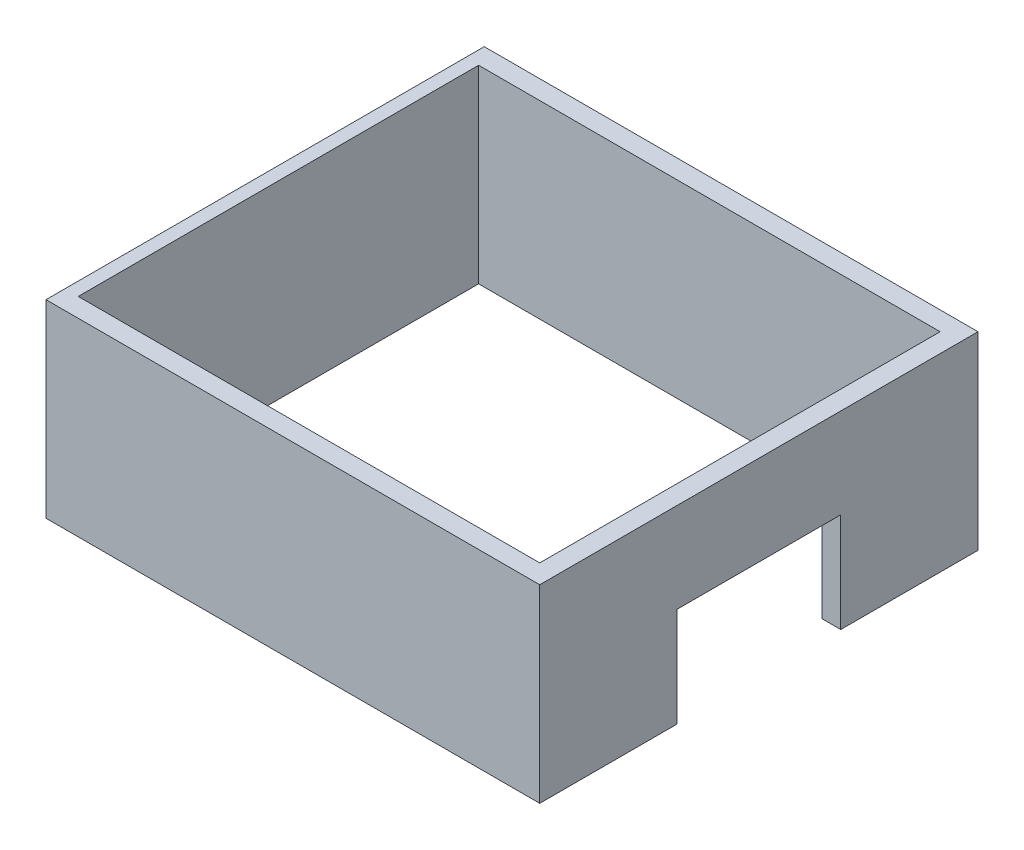
ISO-10303-21;
HEADER;
FILE_DESCRIPTION(('STEP AP214'),'2;1');
FILE_NAME('part.step','',(''),(''),'','','');
FILE_SCHEMA(('AUTOMOTIVE_DESIGN { 1 0 10303 214 1 1 1 1 }'));
ENDSEC;
DATA;
#1=APPLICATION_CONTEXT('core data for automotive mechanical design processes');
#2=APPLICATION_PROTOCOL_DEFINITION('international standard','automotive_design',2000,#1);
#3=PRODUCT_CONTEXT('',#1,'mechanical');
#4=PRODUCT('Part','Part','',(#3));
#5=PRODUCT_RELATED_PRODUCT_CATEGORY('part','',(#4));
#6=PRODUCT_DEFINITION_FORMATION('','',#4);
#7=PRODUCT_DEFINITION_CONTEXT('part definition',#1,'design');
#8=PRODUCT_DEFINITION('design','',#6,#7);
#9=PRODUCT_DEFINITION_SHAPE('','',#8);
#10=(LENGTH_UNIT() NAMED_UNIT(*) SI_UNIT(.MILLI.,.METRE.));
#11=(NAMED_UNIT(*) PLANE_ANGLE_UNIT() SI_UNIT($,.RADIAN.));
#12=(NAMED_UNIT(*) SI_UNIT($,.STERADIAN.) SOLID_ANGLE_UNIT());
#13=UNCERTAINTY_MEASURE_WITH_UNIT(LENGTH_MEASURE(1.E-05),#10,'distance_accuracy_value','');
#14=(GEOMETRIC_REPRESENTATION_CONTEXT(3) GLOBAL_UNCERTAINTY_ASSIGNED_CONTEXT((#13)) GLOBAL_UNIT_ASSIGNED_CONTEXT((#10,
#11,#12)) REPRESENTATION_CONTEXT('',''));
#15=CARTESIAN_POINT('',(0.,0.,0.));
#16=DIRECTION('',(0.,0.,1.));
#17=DIRECTION('',(1.,0.,0.));
#18=AXIS2_PLACEMENT_3D('',#15,#16,#17);
#19=CARTESIAN_POINT('',(23.2591645516478,20.,0.));
#20=DIRECTION('',(-1.,0.,0.));
#21=DIRECTION('',(0.,0.,1.));
#22=AXIS2_PLACEMENT_3D('',#19,#20,#21);
#23=PLANE('',#22);
#24=DIRECTION('',(0.,0.,-1.));
#25=VECTOR('',#24,1.);
#26=CARTESIAN_POINT('',(23.2591645516478,0.,0.));
#27=LINE('',#26,#25);
#28=CARTESIAN_POINT('',(23.2591645516478,0.,23.15));
#29=VERTEX_POINT('',#28);
#30=CARTESIAN_POINT('',(23.2591645516478,0.,8.65));
#31=VERTEX_POINT('',#30);
#32=EDGE_CURVE('E164',#29,#31,#27,.T.);
#33=ORIENTED_EDGE('',*,*,#32,.T.);
#34=DIRECTION('',(0.,-1.,0.));
#35=VECTOR('',#34,1.);
#36=CARTESIAN_POINT('',(23.2591645516478,0.,8.65));
#37=LINE('',#36,#35);
#38=CARTESIAN_POINT('',(23.2591645516478,10.5,8.65));
#39=VERTEX_POINT('',#38);
#40=EDGE_CURVE('E201',#39,#31,#37,.T.);
#41=ORIENTED_EDGE('',*,*,#40,.F.);
#42=DIRECTION('',(0.,0.,1.));
#43=VECTOR('',#42,1.);
#44=CARTESIAN_POINT('',(23.2591645516478,10.5,8.65));
#45=LINE('',#44,#43);
#46=CARTESIAN_POINT('',(23.2591645516478,10.5,-8.64999999999999));
#47=VERTEX_POINT('',#46);
#48=EDGE_CURVE('E210',#47,#39,#45,.T.);
#49=ORIENTED_EDGE('',*,*,#48,.F.);
#50=DIRECTION('',(0.,1.,0.));
#51=VECTOR('',#50,1.);
#52=CARTESIAN_POINT('',(23.2591645516478,10.5,-8.64999999999999));
#53=LINE('',#52,#51);
#54=CARTESIAN_POINT('',(23.2591645516478,0.,-8.65));
#55=VERTEX_POINT('',#54);
#56=EDGE_CURVE('E207',#55,#47,#53,.T.);
#57=ORIENTED_EDGE('',*,*,#56,.F.);
#58=CARTESIAN_POINT('',(23.2591645516478,0.,-23.15));
#59=VERTEX_POINT('',#58);
#60=EDGE_CURVE('E163',#55,#59,#27,.T.);
#61=ORIENTED_EDGE('',*,*,#60,.T.);
#62=DIRECTION('',(0.,-1.,0.));
#63=VECTOR('',#62,1.);
#64=CARTESIAN_POINT('',(23.2591645516478,20.,-23.15));
#65=LINE('',#64,#63);
#66=CARTESIAN_POINT('',(23.2591645516478,20.,-23.15));
#67=VERTEX_POINT('',#66);
#68=EDGE_CURVE('E140',#67,#59,#65,.T.);
#69=ORIENTED_EDGE('',*,*,#68,.F.);
#70=DIRECTION('',(0.,0.,-1.));
#71=VECTOR('',#70,1.);
#72=CARTESIAN_POINT('',(23.2591645516478,20.,0.));
#73=LINE('',#72,#71);
#74=CARTESIAN_POINT('',(23.2591645516478,20.,23.15));
#75=VERTEX_POINT('',#74);
#76=EDGE_CURVE('E128',#75,#67,#73,.T.);
#77=ORIENTED_EDGE('',*,*,#76,.F.);
#78=DIRECTION('',(0.,-1.,0.));
#79=VECTOR('',#78,1.);
#80=CARTESIAN_POINT('',(23.2591645516478,20.,23.15));
#81=LINE('',#80,#79);
#82=EDGE_CURVE('E172',#75,#29,#81,.T.);
#83=ORIENTED_EDGE('',*,*,#82,.T.);
#84=EDGE_LOOP('',(#33,#41,#49,#57,#61,#69,#77,#83));
#85=FACE_BOUND('',#84,.T.);
#86=ADVANCED_FACE('F40',(#85),#23,.F.);
#87=CARTESIAN_POINT('',(0.,20.,-23.15));
#88=DIRECTION('',(0.,0.,1.));
#89=DIRECTION('',(1.,0.,0.));
#90=AXIS2_PLACEMENT_3D('',#87,#88,#89);
#91=PLANE('',#90);
#92=DIRECTION('',(-1.,0.,0.));
#93=VECTOR('',#92,1.);
#94=CARTESIAN_POINT('',(0.,0.,-23.15));
#95=LINE('',#94,#93);
#96=CARTESIAN_POINT('',(-28.9031266724193,0.,-23.15));
#97=VERTEX_POINT('',#96);
#98=EDGE_CURVE('E137',#59,#97,#95,.T.);
#99=ORIENTED_EDGE('',*,*,#98,.T.);
#100=DIRECTION('',(0.,-1.,0.));
#101=VECTOR('',#100,1.);
#102=CARTESIAN_POINT('',(-28.9031266724193,20.,-23.15));
#103=LINE('',#102,#101);
#104=CARTESIAN_POINT('',(-28.9031266724193,20.,-23.15));
#105=VERTEX_POINT('',#104);
#106=EDGE_CURVE('E134',#105,#97,#103,.T.);
#107=ORIENTED_EDGE('',*,*,#106,.F.);
#108=DIRECTION('',(-1.,0.,0.));
#109=VECTOR('',#108,1.);
#110=CARTESIAN_POINT('',(0.,20.,-23.15));
#111=LINE('',#110,#109);
#112=EDGE_CURVE('E121',#67,#105,#111,.T.);
#113=ORIENTED_EDGE('',*,*,#112,.F.);
#114=ORIENTED_EDGE('',*,*,#68,.T.);
#115=EDGE_LOOP('',(#99,#107,#113,#114));
#116=FACE_BOUND('',#115,.T.);
#117=ADVANCED_FACE('F135',(#116),#91,.F.);
#118=CARTESIAN_POINT('',(-28.9031266724193,20.,0.));
#119=DIRECTION('',(1.,0.,0.));
#120=DIRECTION('',(0.,0.,-1.));
#121=AXIS2_PLACEMENT_3D('',#118,#119,#120);
#122=PLANE('',#121);
#123=DIRECTION('',(0.,0.,1.));
#124=VECTOR('',#123,1.);
#125=CARTESIAN_POINT('',(-28.9031266724193,0.,0.));
#126=LINE('',#125,#124);
#127=CARTESIAN_POINT('',(-28.9031266724193,0.,23.15));
#128=VERTEX_POINT('',#127);
#129=EDGE_CURVE('E168',#97,#128,#126,.T.);
#130=ORIENTED_EDGE('',*,*,#129,.T.);
#131=DIRECTION('',(0.,-1.,0.));
#132=VECTOR('',#131,1.);
#133=CARTESIAN_POINT('',(-28.9031266724193,20.,23.15));
#134=LINE('',#133,#132);
#135=CARTESIAN_POINT('',(-28.9031266724193,20.,23.15));
#136=VERTEX_POINT('',#135);
#137=EDGE_CURVE('E141',#136,#128,#134,.T.);
#138=ORIENTED_EDGE('',*,*,#137,.F.);
#139=DIRECTION('',(0.,0.,1.));
#140=VECTOR('',#139,1.);
#141=CARTESIAN_POINT('',(-28.9031266724193,20.,0.));
#142=LINE('',#141,#140);
#143=EDGE_CURVE('E125',#105,#136,#142,.T.);
#144=ORIENTED_EDGE('',*,*,#143,.F.);
#145=ORIENTED_EDGE('',*,*,#106,.T.);
#146=EDGE_LOOP('',(#130,#138,#144,#145));
#147=FACE_BOUND('',#146,.T.);
#148=ADVANCED_FACE('F143',(#147),#122,.F.);
#149=CARTESIAN_POINT('',(-27.4990039314352,20.,0.));
#150=DIRECTION('',(1.,0.,0.));
#151=DIRECTION('',(0.,0.,-1.));
#152=AXIS2_PLACEMENT_3D('',#149,#150,#151);
#153=PLANE('',#152);
#154=DIRECTION('',(0.,0.,1.));
#155=VECTOR('',#154,1.);
#156=CARTESIAN_POINT('',(-27.4990039314352,0.,0.));
#157=LINE('',#156,#155);
#158=CARTESIAN_POINT('',(-27.4990039314352,0.,-21.15));
#159=VERTEX_POINT('',#158);
#160=CARTESIAN_POINT('',(-27.4990039314352,0.,21.15));
#161=VERTEX_POINT('',#160);
#162=EDGE_CURVE('E149',#159,#161,#157,.T.);
#163=ORIENTED_EDGE('',*,*,#162,.F.);
#164=DIRECTION('',(0.,-1.,0.));
#165=VECTOR('',#164,1.);
#166=CARTESIAN_POINT('',(-27.4990039314352,20.,-21.15));
#167=LINE('',#166,#165);
#168=CARTESIAN_POINT('',(-27.4990039314352,20.,-21.15));
#169=VERTEX_POINT('',#168);
#170=EDGE_CURVE('E105',#169,#159,#167,.T.);
#171=ORIENTED_EDGE('',*,*,#170,.F.);
#172=DIRECTION('',(0.,0.,1.));
#173=VECTOR('',#172,1.);
#174=CARTESIAN_POINT('',(-27.4990039314352,20.,0.));
#175=LINE('',#174,#173);
#176=CARTESIAN_POINT('',(-27.4990039314352,20.,21.15));
#177=VERTEX_POINT('',#176);
#178=EDGE_CURVE('E171',#169,#177,#175,.T.);
#179=ORIENTED_EDGE('',*,*,#178,.T.);
#180=DIRECTION('',(0.,-1.,0.));
#181=VECTOR('',#180,1.);
#182=CARTESIAN_POINT('',(-27.4990039314352,20.,21.15));
#183=LINE('',#182,#181);
#184=EDGE_CURVE('E145',#177,#161,#183,.T.);
#185=ORIENTED_EDGE('',*,*,#184,.T.);
#186=EDGE_LOOP('',(#163,#171,#179,#185));
#187=FACE_BOUND('',#186,.T.);
#188=ADVANCED_FACE('F42',(#187),#153,.T.);
#189=CARTESIAN_POINT('',(0.,20.,-21.15));
#190=DIRECTION('',(0.,0.,1.));
#191=DIRECTION('',(1.,0.,0.));
#192=AXIS2_PLACEMENT_3D('',#189,#190,#191);
#193=PLANE('',#192);
#194=DIRECTION('',(-1.,0.,0.));
#195=VECTOR('',#194,1.);
#196=CARTESIAN_POINT('',(0.,0.,-21.15));
#197=LINE('',#196,#195);
#198=CARTESIAN_POINT('',(21.2591645516478,0.,-21.15));
#199=VERTEX_POINT('',#198);
#200=EDGE_CURVE('E152',#199,#159,#197,.T.);
#201=ORIENTED_EDGE('',*,*,#200,.F.);
#202=DIRECTION('',(0.,-1.,0.));
#203=VECTOR('',#202,1.);
#204=CARTESIAN_POINT('',(21.2591645516478,20.,-21.15));
#205=LINE('',#204,#203);
#206=CARTESIAN_POINT('',(21.2591645516478,20.,-21.15));
#207=VERTEX_POINT('',#206);
#208=EDGE_CURVE('E180',#207,#199,#205,.T.);
#209=ORIENTED_EDGE('',*,*,#208,.F.);
#210=DIRECTION('',(-1.,0.,0.));
#211=VECTOR('',#210,1.);
#212=CARTESIAN_POINT('',(0.,20.,-21.15));
#213=LINE('',#212,#211);
#214=EDGE_CURVE('E225',#207,#169,#213,.T.);
#215=ORIENTED_EDGE('',*,*,#214,.T.);
#216=ORIENTED_EDGE('',*,*,#170,.T.);
#217=EDGE_LOOP('',(#201,#209,#215,#216));
#218=FACE_BOUND('',#217,.T.);
#219=ADVANCED_FACE('F246',(#218),#193,.T.);
#220=CARTESIAN_POINT('',(21.2591645516478,20.,0.));
#221=DIRECTION('',(-1.,0.,0.));
#222=DIRECTION('',(0.,0.,1.));
#223=AXIS2_PLACEMENT_3D('',#220,#221,#222);
#224=PLANE('',#223);
#225=DIRECTION('',(0.,1.,0.));
#226=VECTOR('',#225,1.);
#227=CARTESIAN_POINT('',(21.2591645516478,20.,8.65));
#228=LINE('',#227,#226);
#229=CARTESIAN_POINT('',(21.2591645516478,0.,8.65));
#230=VERTEX_POINT('',#229);
#231=CARTESIAN_POINT('',(21.2591645516478,10.5,8.65));
#232=VERTEX_POINT('',#231);
#233=EDGE_CURVE('E153',#230,#232,#228,.T.);
#234=ORIENTED_EDGE('',*,*,#233,.F.);
#235=DIRECTION('',(0.,0.,-1.));
#236=VECTOR('',#235,1.);
#237=CARTESIAN_POINT('',(21.2591645516478,0.,0.));
#238=LINE('',#237,#236);
#239=CARTESIAN_POINT('',(21.2591645516478,0.,21.15));
#240=VERTEX_POINT('',#239);
#241=EDGE_CURVE('E157',#240,#230,#238,.T.);
#242=ORIENTED_EDGE('',*,*,#241,.F.);
#243=DIRECTION('',(0.,-1.,0.));
#244=VECTOR('',#243,1.);
#245=CARTESIAN_POINT('',(21.2591645516478,20.,21.15));
#246=LINE('',#245,#244);
#247=CARTESIAN_POINT('',(21.2591645516478,20.,21.15));
#248=VERTEX_POINT('',#247);
#249=EDGE_CURVE('E178',#248,#240,#246,.T.);
#250=ORIENTED_EDGE('',*,*,#249,.F.);
#251=DIRECTION('',(0.,0.,-1.));
#252=VECTOR('',#251,1.);
#253=CARTESIAN_POINT('',(21.2591645516478,20.,0.));
#254=LINE('',#253,#252);
#255=EDGE_CURVE('E228',#248,#207,#254,.T.);
#256=ORIENTED_EDGE('',*,*,#255,.T.);
#257=ORIENTED_EDGE('',*,*,#208,.T.);
#258=CARTESIAN_POINT('',(21.2591645516478,0.,-8.65));
#259=VERTEX_POINT('',#258);
#260=EDGE_CURVE('E156',#259,#199,#238,.T.);
#261=ORIENTED_EDGE('',*,*,#260,.F.);
#262=DIRECTION('',(0.,-1.,0.));
#263=VECTOR('',#262,1.);
#264=CARTESIAN_POINT('',(21.2591645516478,20.,-8.64999999999999));
#265=LINE('',#264,#263);
#266=CARTESIAN_POINT('',(21.2591645516478,10.5,-8.64999999999999));
#267=VERTEX_POINT('',#266);
#268=EDGE_CURVE('E55',#267,#259,#265,.T.);
#269=ORIENTED_EDGE('',*,*,#268,.F.);
#270=DIRECTION('',(0.,0.,-1.));
#271=VECTOR('',#270,1.);
#272=CARTESIAN_POINT('',(21.2591645516478,10.5,0.));
#273=LINE('',#272,#271);
#274=EDGE_CURVE('E11',#232,#267,#273,.T.);
#275=ORIENTED_EDGE('',*,*,#274,.F.);
#276=EDGE_LOOP('',(#234,#242,#250,#256,#257,#261,#269,#275));
#277=FACE_BOUND('',#276,.T.);
#278=ADVANCED_FACE('F241',(#277),#224,.T.);
#279=CARTESIAN_POINT('',(0.,20.,21.15));
#280=DIRECTION('',(0.,0.,-1.));
#281=DIRECTION('',(-1.,0.,0.));
#282=AXIS2_PLACEMENT_3D('',#279,#280,#281);
#283=PLANE('',#282);
#284=DIRECTION('',(1.,0.,0.));
#285=VECTOR('',#284,1.);
#286=CARTESIAN_POINT('',(0.,0.,21.15));
#287=LINE('',#286,#285);
#288=EDGE_CURVE('E160',#161,#240,#287,.T.);
#289=ORIENTED_EDGE('',*,*,#288,.F.);
#290=ORIENTED_EDGE('',*,*,#184,.F.);
#291=DIRECTION('',(1.,0.,0.));
#292=VECTOR('',#291,1.);
#293=CARTESIAN_POINT('',(0.,20.,21.15));
#294=LINE('',#293,#292);
#295=EDGE_CURVE('E231',#177,#248,#294,.T.);
#296=ORIENTED_EDGE('',*,*,#295,.T.);
#297=ORIENTED_EDGE('',*,*,#249,.T.);
#298=EDGE_LOOP('',(#289,#290,#296,#297));
#299=FACE_BOUND('',#298,.T.);
#300=ADVANCED_FACE('F236',(#299),#283,.T.);
#301=CARTESIAN_POINT('',(0.,20.,23.15));
#302=DIRECTION('',(0.,0.,-1.));
#303=DIRECTION('',(-1.,0.,0.));
#304=AXIS2_PLACEMENT_3D('',#301,#302,#303);
#305=PLANE('',#304);
#306=DIRECTION('',(1.,0.,0.));
#307=VECTOR('',#306,1.);
#308=CARTESIAN_POINT('',(0.,0.,23.15));
#309=LINE('',#308,#307);
#310=EDGE_CURVE('E97',#128,#29,#309,.T.);
#311=ORIENTED_EDGE('',*,*,#310,.T.);
#312=ORIENTED_EDGE('',*,*,#82,.F.);
#313=DIRECTION('',(1.,0.,0.));
#314=VECTOR('',#313,1.);
#315=CARTESIAN_POINT('',(0.,20.,23.15));
#316=LINE('',#315,#314);
#317=EDGE_CURVE('E64',#136,#75,#316,.T.);
#318=ORIENTED_EDGE('',*,*,#317,.F.);
#319=ORIENTED_EDGE('',*,*,#137,.T.);
#320=EDGE_LOOP('',(#311,#312,#318,#319));
#321=FACE_BOUND('',#320,.T.);
#322=ADVANCED_FACE('F202',(#321),#305,.F.);
#323=CARTESIAN_POINT('',(0.,20.,0.));
#324=DIRECTION('',(0.,1.,0.));
#325=DIRECTION('',(0.,0.,1.));
#326=AXIS2_PLACEMENT_3D('',#323,#324,#325);
#327=PLANE('',#326);
#328=ORIENTED_EDGE('',*,*,#178,.F.);
#329=ORIENTED_EDGE('',*,*,#214,.F.);
#330=ORIENTED_EDGE('',*,*,#255,.F.);
#331=ORIENTED_EDGE('',*,*,#295,.F.);
#332=EDGE_LOOP('',(#328,#329,#330,#331));
#333=FACE_BOUND('',#332,.T.);
#334=ORIENTED_EDGE('',*,*,#76,.T.);
#335=ORIENTED_EDGE('',*,*,#112,.T.);
#336=ORIENTED_EDGE('',*,*,#143,.T.);
#337=ORIENTED_EDGE('',*,*,#317,.T.);
#338=EDGE_LOOP('',(#334,#335,#336,#337));
#339=FACE_BOUND('',#338,.T.);
#340=ADVANCED_FACE('F123',(#333,#339),#327,.T.);
#341=CARTESIAN_POINT('',(0.,0.,0.));
#342=DIRECTION('',(0.,1.,0.));
#343=DIRECTION('',(0.,0.,1.));
#344=AXIS2_PLACEMENT_3D('',#341,#342,#343);
#345=PLANE('',#344);
#346=ORIENTED_EDGE('',*,*,#241,.T.);
#347=DIRECTION('',(1.,0.,0.));
#348=VECTOR('',#347,1.);
#349=CARTESIAN_POINT('',(0.,0.,8.65));
#350=LINE('',#349,#348);
#351=EDGE_CURVE('E48',#230,#31,#350,.T.);
#352=ORIENTED_EDGE('',*,*,#351,.T.);
#353=ORIENTED_EDGE('',*,*,#32,.F.);
#354=ORIENTED_EDGE('',*,*,#310,.F.);
#355=ORIENTED_EDGE('',*,*,#129,.F.);
#356=ORIENTED_EDGE('',*,*,#98,.F.);
#357=ORIENTED_EDGE('',*,*,#60,.F.);
#358=DIRECTION('',(-1.,0.,0.));
#359=VECTOR('',#358,1.);
#360=CARTESIAN_POINT('',(0.,0.,-8.65));
#361=LINE('',#360,#359);
#362=EDGE_CURVE('E176',#55,#259,#361,.T.);
#363=ORIENTED_EDGE('',*,*,#362,.T.);
#364=ORIENTED_EDGE('',*,*,#260,.T.);
#365=ORIENTED_EDGE('',*,*,#200,.T.);
#366=ORIENTED_EDGE('',*,*,#162,.T.);
#367=ORIENTED_EDGE('',*,*,#288,.T.);
#368=EDGE_LOOP('',(#346,#352,#353,#354,#355,#356,#357,#363,#364,#365,#366,#367));
#369=FACE_BOUND('',#368,.T.);
#370=ADVANCED_FACE('F189',(#369),#345,.F.);
#371=CARTESIAN_POINT('',(3.25916455164784,0.,8.65));
#372=DIRECTION('',(0.,0.,1.));
#373=DIRECTION('',(1.,0.,0.));
#374=AXIS2_PLACEMENT_3D('',#371,#372,#373);
#375=PLANE('',#374);
#376=ORIENTED_EDGE('',*,*,#233,.T.);
#377=DIRECTION('',(1.,0.,0.));
#378=VECTOR('',#377,1.);
#379=CARTESIAN_POINT('',(3.25916455164784,10.5,8.65));
#380=LINE('',#379,#378);
#381=EDGE_CURVE('E217',#232,#39,#380,.T.);
#382=ORIENTED_EDGE('',*,*,#381,.T.);
#383=ORIENTED_EDGE('',*,*,#40,.T.);
#384=ORIENTED_EDGE('',*,*,#351,.F.);
#385=EDGE_LOOP('',(#376,#382,#383,#384));
#386=FACE_BOUND('',#385,.T.);
#387=ADVANCED_FACE('F289',(#386),#375,.F.);
#388=CARTESIAN_POINT('',(3.25916455164784,10.5,8.65));
#389=DIRECTION('',(0.,1.,0.));
#390=DIRECTION('',(0.,0.,1.));
#391=AXIS2_PLACEMENT_3D('',#388,#389,#390);
#392=PLANE('',#391);
#393=ORIENTED_EDGE('',*,*,#274,.T.);
#394=DIRECTION('',(1.,0.,0.));
#395=VECTOR('',#394,1.);
#396=CARTESIAN_POINT('',(3.25916455164784,10.5,-8.64999999999999));
#397=LINE('',#396,#395);
#398=EDGE_CURVE('E216',#267,#47,#397,.T.);
#399=ORIENTED_EDGE('',*,*,#398,.T.);
#400=ORIENTED_EDGE('',*,*,#48,.T.);
#401=ORIENTED_EDGE('',*,*,#381,.F.);
#402=EDGE_LOOP('',(#393,#399,#400,#401));
#403=FACE_BOUND('',#402,.T.);
#404=ADVANCED_FACE('F296',(#403),#392,.F.);
#405=CARTESIAN_POINT('',(3.25916455164784,10.5,-8.64999999999999));
#406=DIRECTION('',(0.,0.,-1.));
#407=DIRECTION('',(0.,1.,0.));
#408=AXIS2_PLACEMENT_3D('',#405,#406,#407);
#409=PLANE('',#408);
#410=ORIENTED_EDGE('',*,*,#268,.T.);
#411=ORIENTED_EDGE('',*,*,#362,.F.);
#412=ORIENTED_EDGE('',*,*,#56,.T.);
#413=ORIENTED_EDGE('',*,*,#398,.F.);
#414=EDGE_LOOP('',(#410,#411,#412,#413));
#415=FACE_BOUND('',#414,.T.);
#416=ADVANCED_FACE('F303',(#415),#409,.F.);
#417=CLOSED_SHELL('',(#86,#117,#148,#188,#219,#278,#300,#322,#340,#370,#387,#404,#416));
#418=MANIFOLD_SOLID_BREP('B2',#417);
#419=ADVANCED_BREP_SHAPE_REPRESENTATION('',(#18,#418),#14);
#420=SHAPE_DEFINITION_REPRESENTATION(#9,#419);
ENDSEC;
END-ISO-10303-21;
